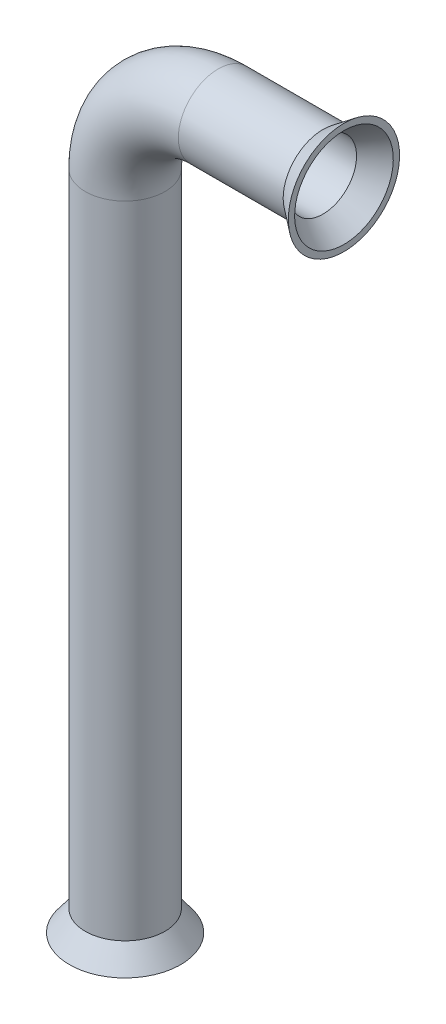
ISO-10303-21;
HEADER;
FILE_DESCRIPTION(('STEP AP214'),'2;1');
FILE_NAME('part.step','',(''),(''),'','','');
FILE_SCHEMA(('AUTOMOTIVE_DESIGN { 1 0 10303 214 1 1 1 1 }'));
ENDSEC;
DATA;
#1=APPLICATION_CONTEXT('core data for automotive mechanical design processes');
#2=APPLICATION_PROTOCOL_DEFINITION('international standard','automotive_design',2000,#1);
#3=PRODUCT_CONTEXT('',#1,'mechanical');
#4=PRODUCT('Part','Part','',(#3));
#5=PRODUCT_RELATED_PRODUCT_CATEGORY('part','',(#4));
#6=PRODUCT_DEFINITION_FORMATION('','',#4);
#7=PRODUCT_DEFINITION_CONTEXT('part definition',#1,'design');
#8=PRODUCT_DEFINITION('design','',#6,#7);
#9=PRODUCT_DEFINITION_SHAPE('','',#8);
#10=(LENGTH_UNIT() NAMED_UNIT(*) SI_UNIT(.MILLI.,.METRE.));
#11=(NAMED_UNIT(*) PLANE_ANGLE_UNIT() SI_UNIT($,.RADIAN.));
#12=(NAMED_UNIT(*) SI_UNIT($,.STERADIAN.) SOLID_ANGLE_UNIT());
#13=UNCERTAINTY_MEASURE_WITH_UNIT(LENGTH_MEASURE(1.E-05),#10,'distance_accuracy_value','');
#14=(GEOMETRIC_REPRESENTATION_CONTEXT(3) GLOBAL_UNCERTAINTY_ASSIGNED_CONTEXT((#13)) GLOBAL_UNIT_ASSIGNED_CONTEXT((#10,
#11,#12)) REPRESENTATION_CONTEXT('',''));
#15=CARTESIAN_POINT('',(0.,0.,0.));
#16=DIRECTION('',(0.,0.,1.));
#17=DIRECTION('',(1.,0.,0.));
#18=AXIS2_PLACEMENT_3D('',#15,#16,#17);
#19=CARTESIAN_POINT('',(0.,0.,0.));
#20=DIRECTION('',(0.,1.,0.));
#21=DIRECTION('',(0.,0.,1.));
#22=AXIS2_PLACEMENT_3D('',#19,#20,#21);
#23=CYLINDRICAL_SURFACE('',#22,4.826);
#24=CARTESIAN_POINT('',(0.,77.6224,0.));
#25=DIRECTION('',(0.,1.,0.));
#26=DIRECTION('',(0.,0.,1.));
#27=AXIS2_PLACEMENT_3D('',#24,#25,#26);
#28=CIRCLE('',#27,4.826);
#29=CARTESIAN_POINT('',(-4.826,77.6224,0.));
#30=VERTEX_POINT('',#29);
#31=EDGE_CURVE('E50',#30,#30,#28,.T.);
#32=ORIENTED_EDGE('',*,*,#31,.F.);
#33=EDGE_LOOP('',(#32));
#34=FACE_BOUND('',#33,.T.);
#35=CARTESIAN_POINT('',(0.,0.,0.));
#36=DIRECTION('',(0.,-1.,0.));
#37=DIRECTION('',(0.,0.,-1.));
#38=AXIS2_PLACEMENT_3D('',#35,#36,#37);
#39=CIRCLE('',#38,4.826);
#40=CARTESIAN_POINT('',(0.,0.,-4.826));
#41=VERTEX_POINT('',#40);
#42=EDGE_CURVE('E57',#41,#41,#39,.T.);
#43=ORIENTED_EDGE('',*,*,#42,.F.);
#44=EDGE_LOOP('',(#43));
#45=FACE_BOUND('',#44,.T.);
#46=ADVANCED_FACE('F32',(#34,#45),#23,.T.);
#47=CARTESIAN_POINT('',(11.2776,77.6224,0.));
#48=DIRECTION('',(0.,0.,-1.));
#49=DIRECTION('',(-1.,0.,0.));
#50=AXIS2_PLACEMENT_3D('',#47,#48,#49);
#51=TOROIDAL_SURFACE('',#50,11.2776,4.826);
#52=CARTESIAN_POINT('',(11.2776,88.9,0.));
#53=DIRECTION('',(1.,0.,0.));
#54=DIRECTION('',(0.,0.,1.));
#55=AXIS2_PLACEMENT_3D('',#52,#53,#54);
#56=CIRCLE('',#55,4.826);
#57=CARTESIAN_POINT('',(11.2776,93.726,0.));
#58=VERTEX_POINT('',#57);
#59=EDGE_CURVE('E36',#58,#58,#56,.T.);
#60=CARTESIAN_POINT('',(11.2776,77.6224,0.));
#61=DIRECTION('',(0.,0.,-1.));
#62=DIRECTION('',(-1.,0.,0.));
#63=AXIS2_PLACEMENT_3D('',#60,#61,#62);
#64=CIRCLE('',#63,16.1036);
#65=EDGE_CURVE('',#30,#58,#64,.T.);
#66=ORIENTED_EDGE('',*,*,#31,.T.);
#67=ORIENTED_EDGE('',*,*,#59,.F.);
#68=ORIENTED_EDGE('',*,*,#65,.T.);
#69=ORIENTED_EDGE('',*,*,#65,.F.);
#70=EDGE_LOOP('',(#66,#68,#67,#69));
#71=FACE_BOUND('',#70,.T.);
#72=ADVANCED_FACE('F98',(#71),#51,.T.);
#73=CARTESIAN_POINT('',(11.2776,88.9,0.));
#74=DIRECTION('',(1.,0.,0.));
#75=DIRECTION('',(0.,0.,-1.));
#76=AXIS2_PLACEMENT_3D('',#73,#74,#75);
#77=CYLINDRICAL_SURFACE('',#76,4.826);
#78=CARTESIAN_POINT('',(23.9776,88.9,0.));
#79=DIRECTION('',(1.,0.,0.));
#80=DIRECTION('',(0.,0.,1.));
#81=AXIS2_PLACEMENT_3D('',#78,#79,#80);
#82=CIRCLE('',#81,4.826);
#83=CARTESIAN_POINT('',(23.9776,88.9,4.826));
#84=VERTEX_POINT('',#83);
#85=EDGE_CURVE('E45',#84,#84,#82,.T.);
#86=ORIENTED_EDGE('',*,*,#85,.F.);
#87=EDGE_LOOP('',(#86));
#88=FACE_BOUND('',#87,.T.);
#89=ORIENTED_EDGE('',*,*,#59,.T.);
#90=EDGE_LOOP('',(#89));
#91=FACE_BOUND('',#90,.T.);
#92=ADVANCED_FACE('F34',(#88,#91),#77,.T.);
#93=CARTESIAN_POINT('',(0.,0.,0.));
#94=DIRECTION('',(0.,1.,0.));
#95=DIRECTION('',(0.,0.,1.));
#96=AXIS2_PLACEMENT_3D('',#93,#94,#95);
#97=CYLINDRICAL_SURFACE('',#96,4.064);
#98=CARTESIAN_POINT('',(0.,77.6224,0.));
#99=DIRECTION('',(0.,1.,0.));
#100=DIRECTION('',(0.,0.,1.));
#101=AXIS2_PLACEMENT_3D('',#98,#99,#100);
#102=CIRCLE('',#101,4.064);
#103=CARTESIAN_POINT('',(-4.064,77.6224,0.));
#104=VERTEX_POINT('',#103);
#105=EDGE_CURVE('E40',#104,#104,#102,.F.);
#106=ORIENTED_EDGE('',*,*,#105,.F.);
#107=EDGE_LOOP('',(#106));
#108=FACE_BOUND('',#107,.T.);
#109=CARTESIAN_POINT('',(0.,0.,0.));
#110=DIRECTION('',(0.,-1.,0.));
#111=DIRECTION('',(0.,0.,-1.));
#112=AXIS2_PLACEMENT_3D('',#109,#110,#111);
#113=CIRCLE('',#112,4.064);
#114=CARTESIAN_POINT('',(0.,0.,-4.064));
#115=VERTEX_POINT('',#114);
#116=EDGE_CURVE('E61',#115,#115,#113,.T.);
#117=ORIENTED_EDGE('',*,*,#116,.T.);
#118=EDGE_LOOP('',(#117));
#119=FACE_BOUND('',#118,.T.);
#120=ADVANCED_FACE('F97',(#108,#119),#97,.F.);
#121=CARTESIAN_POINT('',(11.2776,77.6224,0.));
#122=DIRECTION('',(0.,0.,-1.));
#123=DIRECTION('',(-1.,0.,0.));
#124=AXIS2_PLACEMENT_3D('',#121,#122,#123);
#125=TOROIDAL_SURFACE('',#124,11.2776,4.064);
#126=CARTESIAN_POINT('',(11.2776,88.9,0.));
#127=DIRECTION('',(1.,0.,0.));
#128=DIRECTION('',(0.,0.,1.));
#129=AXIS2_PLACEMENT_3D('',#126,#127,#128);
#130=CIRCLE('',#129,4.064);
#131=CARTESIAN_POINT('',(11.2776,92.964,0.));
#132=VERTEX_POINT('',#131);
#133=EDGE_CURVE('E10',#132,#132,#130,.F.);
#134=CARTESIAN_POINT('',(11.2776,77.6224,0.));
#135=DIRECTION('',(0.,0.,-1.));
#136=DIRECTION('',(-1.,0.,0.));
#137=AXIS2_PLACEMENT_3D('',#134,#135,#136);
#138=CIRCLE('',#137,15.3416);
#139=EDGE_CURVE('',#104,#132,#138,.T.);
#140=ORIENTED_EDGE('',*,*,#105,.T.);
#141=ORIENTED_EDGE('',*,*,#133,.F.);
#142=ORIENTED_EDGE('',*,*,#139,.T.);
#143=ORIENTED_EDGE('',*,*,#139,.F.);
#144=EDGE_LOOP('',(#140,#142,#141,#143));
#145=FACE_BOUND('',#144,.T.);
#146=ADVANCED_FACE('F110',(#145),#125,.F.);
#147=CARTESIAN_POINT('',(11.2776,88.9,0.));
#148=DIRECTION('',(1.,0.,0.));
#149=DIRECTION('',(0.,0.,-1.));
#150=AXIS2_PLACEMENT_3D('',#147,#148,#149);
#151=CYLINDRICAL_SURFACE('',#150,4.064);
#152=CARTESIAN_POINT('',(23.9775999999999,88.9,0.));
#153=DIRECTION('',(1.,0.,0.));
#154=DIRECTION('',(0.,1.,0.));
#155=AXIS2_PLACEMENT_3D('',#152,#153,#154);
#156=CIRCLE('',#155,4.064);
#157=CARTESIAN_POINT('',(23.9775999999999,92.964,0.));
#158=VERTEX_POINT('',#157);
#159=EDGE_CURVE('E72',#158,#158,#156,.T.);
#160=ORIENTED_EDGE('',*,*,#159,.T.);
#161=EDGE_LOOP('',(#160));
#162=FACE_BOUND('',#161,.T.);
#163=ORIENTED_EDGE('',*,*,#133,.T.);
#164=EDGE_LOOP('',(#163));
#165=FACE_BOUND('',#164,.T.);
#166=ADVANCED_FACE('F108',(#162,#165),#151,.F.);
#167=CARTESIAN_POINT('',(0.,0.,0.));
#168=DIRECTION('',(0.,-1.,0.));
#169=DIRECTION('',(0.,0.,-1.));
#170=AXIS2_PLACEMENT_3D('',#167,#168,#169);
#171=CONICAL_SURFACE('',#170,4.826,0.645771823237903);
#172=CARTESIAN_POINT('',(0.,-2.54,0.));
#173=DIRECTION('',(0.,-1.,0.));
#174=DIRECTION('',(0.,0.,-1.));
#175=AXIS2_PLACEMENT_3D('',#172,#173,#174);
#176=CIRCLE('',#175,6.7400272872611);
#177=CARTESIAN_POINT('',(0.,-2.54,-6.7400272872611));
#178=VERTEX_POINT('',#177);
#179=EDGE_CURVE('E52',#178,#178,#176,.T.);
#180=ORIENTED_EDGE('',*,*,#179,.F.);
#181=EDGE_LOOP('',(#180));
#182=FACE_BOUND('',#181,.T.);
#183=ORIENTED_EDGE('',*,*,#42,.T.);
#184=EDGE_LOOP('',(#183));
#185=FACE_BOUND('',#184,.T.);
#186=ADVANCED_FACE('F107',(#182,#185),#171,.T.);
#187=CARTESIAN_POINT('',(0.,-2.54,0.));
#188=DIRECTION('',(0.,-1.,0.));
#189=DIRECTION('',(0.,0.,-1.));
#190=AXIS2_PLACEMENT_3D('',#187,#188,#189);
#191=PLANE('',#190);
#192=CARTESIAN_POINT('',(0.,-2.54,0.));
#193=DIRECTION('',(0.,-1.,0.));
#194=DIRECTION('',(0.,0.,-1.));
#195=AXIS2_PLACEMENT_3D('',#192,#193,#194);
#196=CIRCLE('',#195,5.9780272872611);
#197=CARTESIAN_POINT('',(0.,-2.54,-5.9780272872611));
#198=VERTEX_POINT('',#197);
#199=EDGE_CURVE('E66',#198,#198,#196,.T.);
#200=ORIENTED_EDGE('',*,*,#199,.F.);
#201=EDGE_LOOP('',(#200));
#202=FACE_BOUND('',#201,.T.);
#203=ORIENTED_EDGE('',*,*,#179,.T.);
#204=EDGE_LOOP('',(#203));
#205=FACE_BOUND('',#204,.T.);
#206=ADVANCED_FACE('F117',(#202,#205),#191,.T.);
#207=CARTESIAN_POINT('',(0.,-2.54,0.));
#208=DIRECTION('',(0.,-1.,0.));
#209=DIRECTION('',(0.,0.,-1.));
#210=AXIS2_PLACEMENT_3D('',#207,#208,#209);
#211=CONICAL_SURFACE('',#210,5.9780272872611,0.645771823237903);
#212=ORIENTED_EDGE('',*,*,#199,.T.);
#213=EDGE_LOOP('',(#212));
#214=FACE_BOUND('',#213,.T.);
#215=ORIENTED_EDGE('',*,*,#116,.F.);
#216=EDGE_LOOP('',(#215));
#217=FACE_BOUND('',#216,.T.);
#218=ADVANCED_FACE('F91',(#214,#217),#211,.F.);
#219=CARTESIAN_POINT('',(23.9775999999999,88.9,0.));
#220=DIRECTION('',(1.,0.,0.));
#221=DIRECTION('',(0.,1.,0.));
#222=AXIS2_PLACEMENT_3D('',#219,#220,#221);
#223=CONICAL_SURFACE('',#222,4.82599999999999,0.645771823237903);
#224=CARTESIAN_POINT('',(26.5175999999999,88.9,0.));
#225=DIRECTION('',(1.,0.,0.));
#226=DIRECTION('',(0.,1.,0.));
#227=AXIS2_PLACEMENT_3D('',#224,#225,#226);
#228=CIRCLE('',#227,6.7400272872611);
#229=CARTESIAN_POINT('',(26.5175999999999,95.6400272872611,0.));
#230=VERTEX_POINT('',#229);
#231=EDGE_CURVE('E69',#230,#230,#228,.T.);
#232=ORIENTED_EDGE('',*,*,#231,.F.);
#233=EDGE_LOOP('',(#232));
#234=FACE_BOUND('',#233,.T.);
#235=ORIENTED_EDGE('',*,*,#85,.T.);
#236=EDGE_LOOP('',(#235));
#237=FACE_BOUND('',#236,.T.);
#238=ADVANCED_FACE('F85',(#234,#237),#223,.T.);
#239=CARTESIAN_POINT('',(26.5175999999999,88.9,0.));
#240=DIRECTION('',(1.,0.,0.));
#241=DIRECTION('',(0.,1.,0.));
#242=AXIS2_PLACEMENT_3D('',#239,#240,#241);
#243=PLANE('',#242);
#244=CARTESIAN_POINT('',(26.5175999999999,88.9,0.));
#245=DIRECTION('',(1.,0.,0.));
#246=DIRECTION('',(0.,1.,0.));
#247=AXIS2_PLACEMENT_3D('',#244,#245,#246);
#248=CIRCLE('',#247,5.97802728726111);
#249=CARTESIAN_POINT('',(26.5175999999999,94.8780272872611,0.));
#250=VERTEX_POINT('',#249);
#251=EDGE_CURVE('E75',#250,#250,#248,.T.);
#252=ORIENTED_EDGE('',*,*,#251,.F.);
#253=EDGE_LOOP('',(#252));
#254=FACE_BOUND('',#253,.T.);
#255=ORIENTED_EDGE('',*,*,#231,.T.);
#256=EDGE_LOOP('',(#255));
#257=FACE_BOUND('',#256,.T.);
#258=ADVANCED_FACE('F82',(#254,#257),#243,.T.);
#259=CARTESIAN_POINT('',(26.5175999999999,88.9,0.));
#260=DIRECTION('',(1.,0.,0.));
#261=DIRECTION('',(0.,1.,0.));
#262=AXIS2_PLACEMENT_3D('',#259,#260,#261);
#263=CONICAL_SURFACE('',#262,5.97802728726111,0.645771823237903);
#264=ORIENTED_EDGE('',*,*,#251,.T.);
#265=EDGE_LOOP('',(#264));
#266=FACE_BOUND('',#265,.T.);
#267=ORIENTED_EDGE('',*,*,#159,.F.);
#268=EDGE_LOOP('',(#267));
#269=FACE_BOUND('',#268,.T.);
#270=ADVANCED_FACE('F79',(#266,#269),#263,.F.);
#271=CLOSED_SHELL('',(#46,#72,#92,#120,#146,#166,#186,#206,#218,#238,#258,#270));
#272=MANIFOLD_SOLID_BREP('B2',#271);
#273=ADVANCED_BREP_SHAPE_REPRESENTATION('',(#18,#272),#14);
#274=SHAPE_DEFINITION_REPRESENTATION(#9,#273);
ENDSEC;
END-ISO-10303-21;
